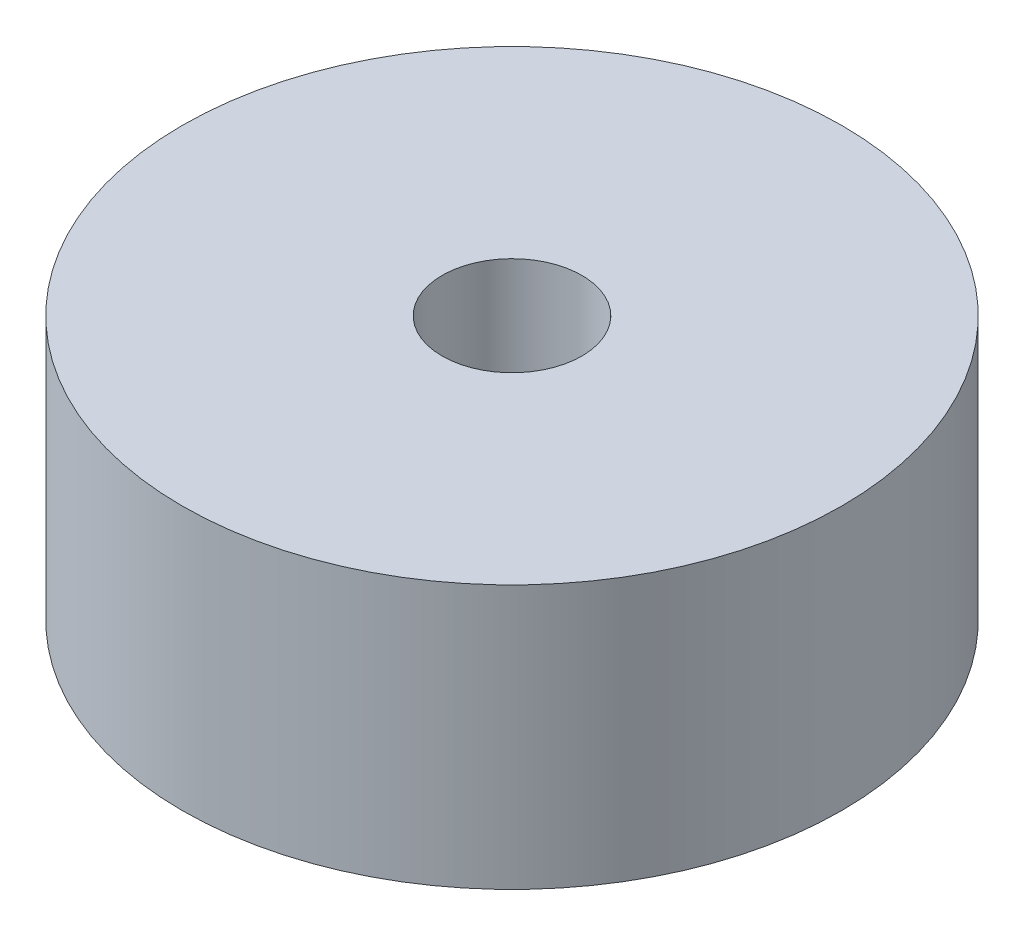
ISO-10303-21;
HEADER;
FILE_DESCRIPTION(('STEP AP214'),'2;1');
FILE_NAME('part.step','',(''),(''),'','','');
FILE_SCHEMA(('AUTOMOTIVE_DESIGN { 1 0 10303 214 1 1 1 1 }'));
ENDSEC;
DATA;
#1=APPLICATION_CONTEXT('core data for automotive mechanical design processes');
#2=APPLICATION_PROTOCOL_DEFINITION('international standard','automotive_design',2000,#1);
#3=PRODUCT_CONTEXT('',#1,'mechanical');
#4=PRODUCT('Part','Part','',(#3));
#5=PRODUCT_RELATED_PRODUCT_CATEGORY('part','',(#4));
#6=PRODUCT_DEFINITION_FORMATION('','',#4);
#7=PRODUCT_DEFINITION_CONTEXT('part definition',#1,'design');
#8=PRODUCT_DEFINITION('design','',#6,#7);
#9=PRODUCT_DEFINITION_SHAPE('','',#8);
#10=(LENGTH_UNIT() NAMED_UNIT(*) SI_UNIT(.MILLI.,.METRE.));
#11=(NAMED_UNIT(*) PLANE_ANGLE_UNIT() SI_UNIT($,.RADIAN.));
#12=(NAMED_UNIT(*) SI_UNIT($,.STERADIAN.) SOLID_ANGLE_UNIT());
#13=UNCERTAINTY_MEASURE_WITH_UNIT(LENGTH_MEASURE(1.E-05),#10,'distance_accuracy_value','');
#14=(GEOMETRIC_REPRESENTATION_CONTEXT(3) GLOBAL_UNCERTAINTY_ASSIGNED_CONTEXT((#13)) GLOBAL_UNIT_ASSIGNED_CONTEXT((#10,
#11,#12)) REPRESENTATION_CONTEXT('',''));
#15=CARTESIAN_POINT('',(0.,0.,0.));
#16=DIRECTION('',(0.,0.,1.));
#17=DIRECTION('',(1.,0.,0.));
#18=AXIS2_PLACEMENT_3D('',#15,#16,#17);
#19=CARTESIAN_POINT('',(0.,7.62,0.));
#20=DIRECTION('',(0.,-1.,0.));
#21=DIRECTION('',(0.,0.,-1.));
#22=AXIS2_PLACEMENT_3D('',#19,#20,#21);
#23=CYLINDRICAL_SURFACE('',#22,9.525);
#24=CARTESIAN_POINT('',(0.,7.62,0.));
#25=DIRECTION('',(0.,1.,0.));
#26=DIRECTION('',(0.,0.,1.));
#27=AXIS2_PLACEMENT_3D('',#24,#25,#26);
#28=CIRCLE('',#27,9.525);
#29=CARTESIAN_POINT('',(0.,7.62,-9.525));
#30=VERTEX_POINT('',#29);
#31=EDGE_CURVE('E10',#30,#30,#28,.T.);
#32=CARTESIAN_POINT('',(0.,0.,0.));
#33=DIRECTION('',(0.,1.,0.));
#34=DIRECTION('',(0.,0.,1.));
#35=AXIS2_PLACEMENT_3D('',#32,#33,#34);
#36=CIRCLE('',#35,9.525);
#37=CARTESIAN_POINT('',(0.,0.,-9.525));
#38=VERTEX_POINT('',#37);
#39=EDGE_CURVE('E35',#38,#38,#36,.T.);
#40=CARTESIAN_POINT('',(0.,7.62,-9.525));
#41=CARTESIAN_POINT('',(0.,7.540625,-9.525));
#42=CARTESIAN_POINT('',(0.,7.46125,-9.525));
#43=CARTESIAN_POINT('',(0.,7.3025,-9.525));
#44=CARTESIAN_POINT('',(0.,7.223125,-9.525));
#45=CARTESIAN_POINT('',(0.,7.064375,-9.525));
#46=CARTESIAN_POINT('',(0.,6.985,-9.525));
#47=CARTESIAN_POINT('',(0.,6.82625,-9.525));
#48=CARTESIAN_POINT('',(0.,6.746875,-9.525));
#49=CARTESIAN_POINT('',(0.,6.588125,-9.525));
#50=CARTESIAN_POINT('',(0.,6.50875,-9.525));
#51=CARTESIAN_POINT('',(0.,6.35,-9.525));
#52=CARTESIAN_POINT('',(0.,6.270625,-9.525));
#53=CARTESIAN_POINT('',(0.,6.111875,-9.525));
#54=CARTESIAN_POINT('',(0.,6.0325,-9.525));
#55=CARTESIAN_POINT('',(0.,5.87375,-9.525));
#56=CARTESIAN_POINT('',(0.,5.794375,-9.525));
#57=CARTESIAN_POINT('',(0.,5.635625,-9.525));
#58=CARTESIAN_POINT('',(0.,5.55625,-9.525));
#59=CARTESIAN_POINT('',(0.,5.3975,-9.525));
#60=CARTESIAN_POINT('',(0.,5.318125,-9.525));
#61=CARTESIAN_POINT('',(0.,5.159375,-9.525));
#62=CARTESIAN_POINT('',(0.,5.08,-9.525));
#63=CARTESIAN_POINT('',(0.,4.92125,-9.525));
#64=CARTESIAN_POINT('',(0.,4.841875,-9.525));
#65=CARTESIAN_POINT('',(0.,4.683125,-9.525));
#66=CARTESIAN_POINT('',(0.,4.60375,-9.525));
#67=CARTESIAN_POINT('',(0.,4.445,-9.525));
#68=CARTESIAN_POINT('',(0.,4.365625,-9.525));
#69=CARTESIAN_POINT('',(0.,4.206875,-9.525));
#70=CARTESIAN_POINT('',(0.,4.1275,-9.525));
#71=CARTESIAN_POINT('',(0.,3.96875,-9.525));
#72=CARTESIAN_POINT('',(0.,3.889375,-9.525));
#73=CARTESIAN_POINT('',(0.,3.730625,-9.525));
#74=CARTESIAN_POINT('',(0.,3.65125,-9.525));
#75=CARTESIAN_POINT('',(0.,3.4925,-9.525));
#76=CARTESIAN_POINT('',(0.,3.413125,-9.525));
#77=CARTESIAN_POINT('',(0.,3.254375,-9.525));
#78=CARTESIAN_POINT('',(0.,3.175,-9.525));
#79=CARTESIAN_POINT('',(0.,3.01625,-9.525));
#80=CARTESIAN_POINT('',(0.,2.936875,-9.525));
#81=CARTESIAN_POINT('',(0.,2.778125,-9.525));
#82=CARTESIAN_POINT('',(0.,2.69875,-9.525));
#83=CARTESIAN_POINT('',(0.,2.54,-9.525));
#84=CARTESIAN_POINT('',(0.,2.460625,-9.525));
#85=CARTESIAN_POINT('',(0.,2.301875,-9.525));
#86=CARTESIAN_POINT('',(0.,2.2225,-9.525));
#87=CARTESIAN_POINT('',(0.,2.06375,-9.525));
#88=CARTESIAN_POINT('',(0.,1.984375,-9.525));
#89=CARTESIAN_POINT('',(0.,1.825625,-9.525));
#90=CARTESIAN_POINT('',(0.,1.74625,-9.525));
#91=CARTESIAN_POINT('',(0.,1.5875,-9.525));
#92=CARTESIAN_POINT('',(0.,1.508125,-9.525));
#93=CARTESIAN_POINT('',(0.,1.349375,-9.525));
#94=CARTESIAN_POINT('',(0.,1.27,-9.525));
#95=CARTESIAN_POINT('',(0.,1.11125,-9.525));
#96=CARTESIAN_POINT('',(0.,1.031875,-9.525));
#97=CARTESIAN_POINT('',(0.,0.873125,-9.525));
#98=CARTESIAN_POINT('',(0.,0.79375,-9.525));
#99=CARTESIAN_POINT('',(0.,0.635,-9.525));
#100=CARTESIAN_POINT('',(0.,0.555625,-9.525));
#101=CARTESIAN_POINT('',(0.,0.396875,-9.525));
#102=CARTESIAN_POINT('',(0.,0.3175,-9.525));
#103=CARTESIAN_POINT('',(0.,0.15875,-9.525));
#104=CARTESIAN_POINT('',(0.,0.0793749999999999,-9.525));
#105=CARTESIAN_POINT('',(0.,0.,-9.525));
#106=B_SPLINE_CURVE_WITH_KNOTS('',3,(#40,#41,#42,#43,#44,#45,#46,#47,#48,#49,#50,#51,#52,#53,
#54,#55,#56,#57,#58,#59,#60,#61,#62,#63,#64,#65,#66,#67,#68,#69,#70,#71,#72,#73,#74,#75,#76,#77,
#78,#79,#80,#81,#82,#83,#84,#85,#86,#87,#88,#89,#90,#91,#92,#93,#94,#95,#96,#97,#98,#99,#100,
#101,#102,#103,#104,#105),.UNSPECIFIED.,.F.,.F.,(4,2,2,2,2,2,2,2,2,2,2,2,2,2,2,2,2,2,2,2,2,2,2,
2,2,2,2,2,2,2,2,2,4),(0.,0.238125,0.476249999999999,0.714375,0.952499999999999,1.190625,1.42875,
1.666875,1.905,2.143125,2.38125,2.619375,2.8575,3.095625,3.33375,3.571875,3.81,4.048125,4.28625,
4.524375,4.7625,5.000625,5.23875,5.476875,5.715,5.953125,6.19125,6.429375,6.6675,6.905625,
7.14375,7.381875,7.62),.UNSPECIFIED.);
#107=EDGE_CURVE('BSEAM32',#30,#38,#106,.T.);
#108=ORIENTED_EDGE('',*,*,#31,.F.);
#109=ORIENTED_EDGE('',*,*,#39,.T.);
#110=ORIENTED_EDGE('',*,*,#107,.T.);
#111=ORIENTED_EDGE('',*,*,#107,.F.);
#112=EDGE_LOOP('',(#108,#110,#109,#111));
#113=FACE_BOUND('',#112,.T.);
#114=ADVANCED_FACE('F32',(#113),#23,.T.);
#115=CARTESIAN_POINT('',(0.,7.62,0.));
#116=DIRECTION('',(0.,1.,0.));
#117=DIRECTION('',(0.,0.,1.));
#118=AXIS2_PLACEMENT_3D('',#115,#116,#117);
#119=PLANE('',#118);
#120=CARTESIAN_POINT('',(0.,7.62,0.));
#121=DIRECTION('',(0.,1.,0.));
#122=DIRECTION('',(0.,0.,1.));
#123=AXIS2_PLACEMENT_3D('',#120,#121,#122);
#124=CIRCLE('',#123,2.01929999999999);
#125=CARTESIAN_POINT('',(0.,7.62,2.01929999999999));
#126=VERTEX_POINT('',#125);
#127=EDGE_CURVE('E46',#126,#126,#124,.T.);
#128=ORIENTED_EDGE('',*,*,#127,.F.);
#129=EDGE_LOOP('',(#128));
#130=FACE_BOUND('',#129,.T.);
#131=ORIENTED_EDGE('',*,*,#31,.T.);
#132=EDGE_LOOP('',(#131));
#133=FACE_BOUND('',#132,.T.);
#134=ADVANCED_FACE('F52',(#130,#133),#119,.T.);
#135=CARTESIAN_POINT('',(0.,0.,0.));
#136=DIRECTION('',(0.,1.,0.));
#137=DIRECTION('',(0.,0.,1.));
#138=AXIS2_PLACEMENT_3D('',#135,#136,#137);
#139=PLANE('',#138);
#140=CARTESIAN_POINT('',(0.,0.,0.));
#141=DIRECTION('',(0.,1.,0.));
#142=DIRECTION('',(0.,0.,1.));
#143=AXIS2_PLACEMENT_3D('',#140,#141,#142);
#144=CIRCLE('',#143,2.0193);
#145=CARTESIAN_POINT('',(0.,0.,2.0193));
#146=VERTEX_POINT('',#145);
#147=EDGE_CURVE('E42',#146,#146,#144,.T.);
#148=ORIENTED_EDGE('',*,*,#147,.T.);
#149=EDGE_LOOP('',(#148));
#150=FACE_BOUND('',#149,.T.);
#151=ORIENTED_EDGE('',*,*,#39,.F.);
#152=EDGE_LOOP('',(#151));
#153=FACE_BOUND('',#152,.T.);
#154=ADVANCED_FACE('F54',(#150,#153),#139,.F.);
#155=CARTESIAN_POINT('',(0.,7.62,0.));
#156=DIRECTION('',(0.,1.,0.));
#157=DIRECTION('',(0.,0.,1.));
#158=AXIS2_PLACEMENT_3D('',#155,#156,#157);
#159=CYLINDRICAL_SURFACE('',#158,2.01929999999999);
#160=ORIENTED_EDGE('',*,*,#147,.F.);
#161=EDGE_LOOP('',(#160));
#162=FACE_BOUND('',#161,.T.);
#163=ORIENTED_EDGE('',*,*,#127,.T.);
#164=EDGE_LOOP('',(#163));
#165=FACE_BOUND('',#164,.T.);
#166=ADVANCED_FACE('F50',(#162,#165),#159,.F.);
#167=CLOSED_SHELL('',(#114,#134,#154,#166));
#168=MANIFOLD_SOLID_BREP('B2',#167);
#169=ADVANCED_BREP_SHAPE_REPRESENTATION('',(#18,#168),#14);
#170=SHAPE_DEFINITION_REPRESENTATION(#9,#169);
ENDSEC;
END-ISO-10303-21;
